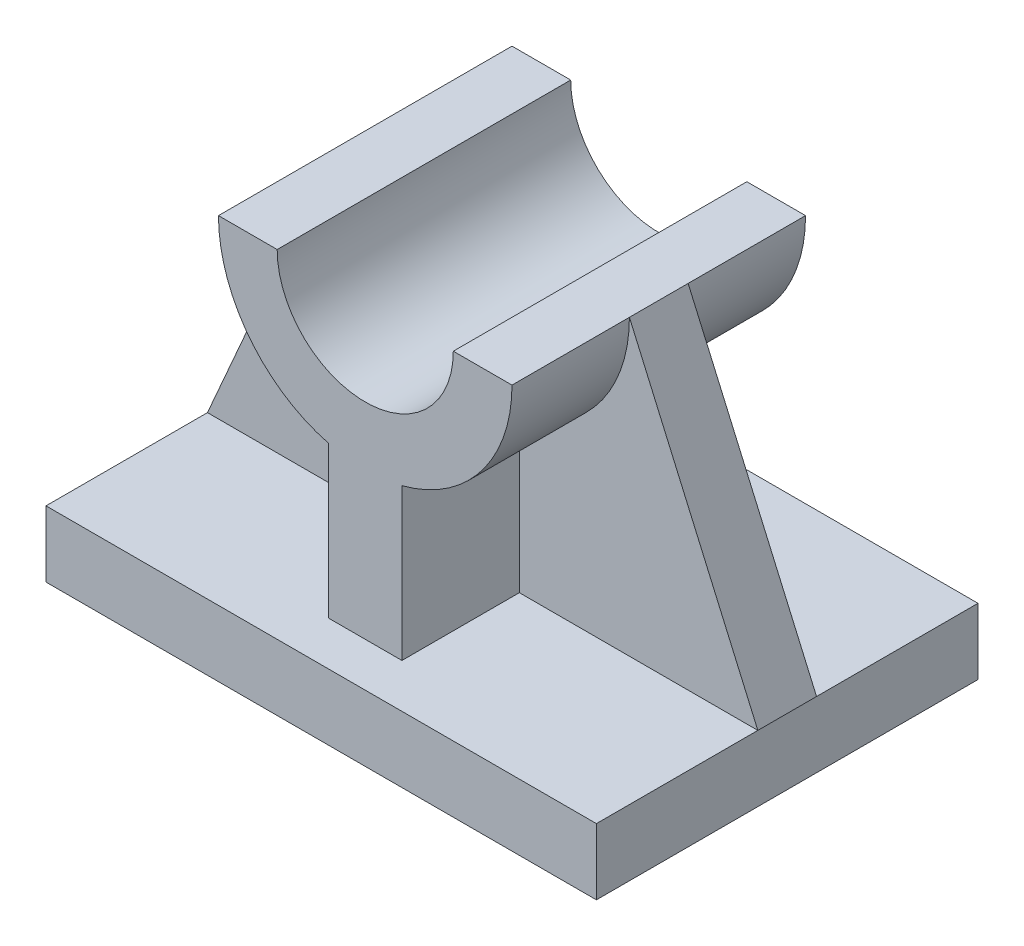
ISO-10303-21;
HEADER;
FILE_DESCRIPTION(('STEP AP214'),'2;1');
FILE_NAME('part.step','',(''),(''),'','','');
FILE_SCHEMA(('AUTOMOTIVE_DESIGN { 1 0 10303 214 1 1 1 1 }'));
ENDSEC;
DATA;
#1=APPLICATION_CONTEXT('core data for automotive mechanical design processes');
#2=APPLICATION_PROTOCOL_DEFINITION('international standard','automotive_design',2000,#1);
#3=PRODUCT_CONTEXT('',#1,'mechanical');
#4=PRODUCT('Part','Part','',(#3));
#5=PRODUCT_RELATED_PRODUCT_CATEGORY('part','',(#4));
#6=PRODUCT_DEFINITION_FORMATION('','',#4);
#7=PRODUCT_DEFINITION_CONTEXT('part definition',#1,'design');
#8=PRODUCT_DEFINITION('design','',#6,#7);
#9=PRODUCT_DEFINITION_SHAPE('','',#8);
#10=(LENGTH_UNIT() NAMED_UNIT(*) SI_UNIT(.MILLI.,.METRE.));
#11=(NAMED_UNIT(*) PLANE_ANGLE_UNIT() SI_UNIT($,.RADIAN.));
#12=(NAMED_UNIT(*) SI_UNIT($,.STERADIAN.) SOLID_ANGLE_UNIT());
#13=UNCERTAINTY_MEASURE_WITH_UNIT(LENGTH_MEASURE(1.E-05),#10,'distance_accuracy_value','');
#14=(GEOMETRIC_REPRESENTATION_CONTEXT(3) GLOBAL_UNCERTAINTY_ASSIGNED_CONTEXT((#13)) GLOBAL_UNIT_ASSIGNED_CONTEXT((#10,
#11,#12)) REPRESENTATION_CONTEXT('',''));
#15=CARTESIAN_POINT('',(0.,0.,0.));
#16=DIRECTION('',(0.,0.,1.));
#17=DIRECTION('',(1.,0.,0.));
#18=AXIS2_PLACEMENT_3D('',#15,#16,#17);
#19=CARTESIAN_POINT('',(0.,-40.,26.));
#20=DIRECTION('',(0.,1.,0.));
#21=DIRECTION('',(-1.,0.,0.));
#22=AXIS2_PLACEMENT_3D('',#19,#20,#21);
#23=PLANE('',#22);
#24=DIRECTION('',(0.,0.,-1.));
#25=VECTOR('',#24,1.);
#26=CARTESIAN_POINT('',(-37.4999999999999,-40.,26.));
#27=LINE('',#26,#25);
#28=CARTESIAN_POINT('',(-37.4999999999999,-40.,-3.99999999999999));
#29=VERTEX_POINT('',#28);
#30=CARTESIAN_POINT('',(-37.4999999999999,-40.,-26.));
#31=VERTEX_POINT('',#30);
#32=EDGE_CURVE('E61',#29,#31,#27,.T.);
#33=ORIENTED_EDGE('',*,*,#32,.F.);
#34=DIRECTION('',(1.,0.,0.));
#35=VECTOR('',#34,1.);
#36=CARTESIAN_POINT('',(0.,-40.,-4.));
#37=LINE('',#36,#35);
#38=CARTESIAN_POINT('',(-5.,-40.,-4.));
#39=VERTEX_POINT('',#38);
#40=EDGE_CURVE('E198',#29,#39,#37,.T.);
#41=ORIENTED_EDGE('',*,*,#40,.T.);
#42=DIRECTION('',(0.,0.,-1.));
#43=VECTOR('',#42,1.);
#44=CARTESIAN_POINT('',(-5.,-40.,20.));
#45=LINE('',#44,#43);
#46=CARTESIAN_POINT('',(-5.,-40.,-20.));
#47=VERTEX_POINT('',#46);
#48=EDGE_CURVE('E184',#39,#47,#45,.T.);
#49=ORIENTED_EDGE('',*,*,#48,.T.);
#50=DIRECTION('',(1.,0.,0.));
#51=VECTOR('',#50,1.);
#52=CARTESIAN_POINT('',(0.,-40.,-20.));
#53=LINE('',#52,#51);
#54=CARTESIAN_POINT('',(5.,-40.,-20.));
#55=VERTEX_POINT('',#54);
#56=EDGE_CURVE('E266',#47,#55,#53,.T.);
#57=ORIENTED_EDGE('',*,*,#56,.T.);
#58=DIRECTION('',(0.,0.,-1.));
#59=VECTOR('',#58,1.);
#60=CARTESIAN_POINT('',(5.,-40.,20.));
#61=LINE('',#60,#59);
#62=CARTESIAN_POINT('',(5.,-40.,-4.));
#63=VERTEX_POINT('',#62);
#64=EDGE_CURVE('E290',#63,#55,#61,.T.);
#65=ORIENTED_EDGE('',*,*,#64,.F.);
#66=DIRECTION('',(1.,0.,0.));
#67=VECTOR('',#66,1.);
#68=CARTESIAN_POINT('',(0.,-40.,-4.));
#69=LINE('',#68,#67);
#70=CARTESIAN_POINT('',(37.5,-40.,-4.));
#71=VERTEX_POINT('',#70);
#72=EDGE_CURVE('E247',#63,#71,#69,.T.);
#73=ORIENTED_EDGE('',*,*,#72,.T.);
#74=DIRECTION('',(0.,0.,-1.));
#75=VECTOR('',#74,1.);
#76=CARTESIAN_POINT('',(37.5,-40.,26.));
#77=LINE('',#76,#75);
#78=CARTESIAN_POINT('',(37.5,-40.,-26.));
#79=VERTEX_POINT('',#78);
#80=EDGE_CURVE('E54',#71,#79,#77,.T.);
#81=ORIENTED_EDGE('',*,*,#80,.T.);
#82=DIRECTION('',(1.,0.,0.));
#83=VECTOR('',#82,1.);
#84=CARTESIAN_POINT('',(0.,-40.,-26.));
#85=LINE('',#84,#83);
#86=EDGE_CURVE('E368',#31,#79,#85,.T.);
#87=ORIENTED_EDGE('',*,*,#86,.F.);
#88=EDGE_LOOP('',(#33,#41,#49,#57,#65,#73,#81,#87));
#89=FACE_BOUND('',#88,.T.);
#90=ADVANCED_FACE('F45',(#89),#23,.T.);
#91=CARTESIAN_POINT('',(0.,0.,20.));
#92=DIRECTION('',(0.,0.,-1.));
#93=DIRECTION('',(-1.,0.,0.));
#94=AXIS2_PLACEMENT_3D('',#91,#92,#93);
#95=CYLINDRICAL_SURFACE('',#94,20.);
#96=CARTESIAN_POINT('',(0.,0.,-4.));
#97=DIRECTION('',(0.,0.,1.));
#98=DIRECTION('',(1.,0.,0.));
#99=AXIS2_PLACEMENT_3D('',#96,#97,#98);
#100=CIRCLE('',#99,20.);
#101=CARTESIAN_POINT('',(-20.,0.,-4.));
#102=VERTEX_POINT('',#101);
#103=CARTESIAN_POINT('',(-5.,-19.3649167310371,-4.));
#104=VERTEX_POINT('',#103);
#105=EDGE_CURVE('E206',#102,#104,#100,.T.);
#106=ORIENTED_EDGE('',*,*,#105,.F.);
#107=DIRECTION('',(0.,0.,-1.));
#108=VECTOR('',#107,1.);
#109=CARTESIAN_POINT('',(-20.,0.,20.));
#110=LINE('',#109,#108);
#111=CARTESIAN_POINT('',(-20.,0.,-20.));
#112=VERTEX_POINT('',#111);
#113=EDGE_CURVE('E327',#102,#112,#110,.T.);
#114=ORIENTED_EDGE('',*,*,#113,.T.);
#115=CARTESIAN_POINT('',(0.,0.,-20.));
#116=DIRECTION('',(0.,0.,1.));
#117=DIRECTION('',(1.,0.,0.));
#118=AXIS2_PLACEMENT_3D('',#115,#116,#117);
#119=CIRCLE('',#118,20.);
#120=CARTESIAN_POINT('',(-5.,-19.3649167310371,-20.));
#121=VERTEX_POINT('',#120);
#122=EDGE_CURVE('E310',#112,#121,#119,.T.);
#123=ORIENTED_EDGE('',*,*,#122,.T.);
#124=DIRECTION('',(0.,0.,-1.));
#125=VECTOR('',#124,1.);
#126=CARTESIAN_POINT('',(-5.,-19.3649167310371,20.));
#127=LINE('',#126,#125);
#128=EDGE_CURVE('E322',#104,#121,#127,.T.);
#129=ORIENTED_EDGE('',*,*,#128,.F.);
#130=EDGE_LOOP('',(#106,#114,#123,#129));
#131=FACE_BOUND('',#130,.T.);
#132=ADVANCED_FACE('F478',(#131),#95,.T.);
#133=CARTESIAN_POINT('',(-5.,0.,20.));
#134=DIRECTION('',(1.,0.,0.));
#135=DIRECTION('',(0.,1.,0.));
#136=AXIS2_PLACEMENT_3D('',#133,#134,#135);
#137=PLANE('',#136);
#138=DIRECTION('',(0.,-1.,0.));
#139=VECTOR('',#138,1.);
#140=CARTESIAN_POINT('',(-5.,0.,-4.));
#141=LINE('',#140,#139);
#142=EDGE_CURVE('E187',#104,#39,#141,.T.);
#143=ORIENTED_EDGE('',*,*,#142,.F.);
#144=ORIENTED_EDGE('',*,*,#128,.T.);
#145=DIRECTION('',(0.,-1.,0.));
#146=VECTOR('',#145,1.);
#147=CARTESIAN_POINT('',(-5.,0.,-20.));
#148=LINE('',#147,#146);
#149=EDGE_CURVE('E190',#121,#47,#148,.T.);
#150=ORIENTED_EDGE('',*,*,#149,.T.);
#151=ORIENTED_EDGE('',*,*,#48,.F.);
#152=EDGE_LOOP('',(#143,#144,#150,#151));
#153=FACE_BOUND('',#152,.T.);
#154=ADVANCED_FACE('F185',(#153),#137,.F.);
#155=CARTESIAN_POINT('',(5.,0.,20.));
#156=DIRECTION('',(1.,0.,0.));
#157=DIRECTION('',(0.,1.,0.));
#158=AXIS2_PLACEMENT_3D('',#155,#156,#157);
#159=PLANE('',#158);
#160=DIRECTION('',(0.,0.,-1.));
#161=VECTOR('',#160,1.);
#162=CARTESIAN_POINT('',(5.,-19.3649167310371,20.));
#163=LINE('',#162,#161);
#164=CARTESIAN_POINT('',(5.,-19.3649167310371,-4.));
#165=VERTEX_POINT('',#164);
#166=CARTESIAN_POINT('',(5.,-19.3649167310371,-20.));
#167=VERTEX_POINT('',#166);
#168=EDGE_CURVE('E343',#165,#167,#163,.T.);
#169=ORIENTED_EDGE('',*,*,#168,.F.);
#170=DIRECTION('',(0.,-1.,0.));
#171=VECTOR('',#170,1.);
#172=CARTESIAN_POINT('',(5.,0.,-4.));
#173=LINE('',#172,#171);
#174=EDGE_CURVE('E243',#165,#63,#173,.T.);
#175=ORIENTED_EDGE('',*,*,#174,.T.);
#176=ORIENTED_EDGE('',*,*,#64,.T.);
#177=DIRECTION('',(0.,-1.,0.));
#178=VECTOR('',#177,1.);
#179=CARTESIAN_POINT('',(5.,0.,-20.));
#180=LINE('',#179,#178);
#181=EDGE_CURVE('E260',#167,#55,#180,.T.);
#182=ORIENTED_EDGE('',*,*,#181,.F.);
#183=EDGE_LOOP('',(#169,#175,#176,#182));
#184=FACE_BOUND('',#183,.T.);
#185=ADVANCED_FACE('F484',(#184),#159,.T.);
#186=CARTESIAN_POINT('',(0.,0.,20.));
#187=DIRECTION('',(0.,0.,-1.));
#188=DIRECTION('',(-1.,0.,0.));
#189=AXIS2_PLACEMENT_3D('',#186,#187,#188);
#190=CYLINDRICAL_SURFACE('',#189,20.);
#191=CARTESIAN_POINT('',(0.,0.,-4.));
#192=DIRECTION('',(0.,0.,1.));
#193=DIRECTION('',(1.,0.,0.));
#194=AXIS2_PLACEMENT_3D('',#191,#192,#193);
#195=CIRCLE('',#194,20.);
#196=CARTESIAN_POINT('',(20.,0.,-4.));
#197=VERTEX_POINT('',#196);
#198=EDGE_CURVE('E223',#165,#197,#195,.T.);
#199=ORIENTED_EDGE('',*,*,#198,.F.);
#200=ORIENTED_EDGE('',*,*,#168,.T.);
#201=CARTESIAN_POINT('',(0.,0.,-20.));
#202=DIRECTION('',(0.,0.,1.));
#203=DIRECTION('',(1.,0.,0.));
#204=AXIS2_PLACEMENT_3D('',#201,#202,#203);
#205=CIRCLE('',#204,20.);
#206=CARTESIAN_POINT('',(20.,0.,-20.));
#207=VERTEX_POINT('',#206);
#208=EDGE_CURVE('E294',#167,#207,#205,.T.);
#209=ORIENTED_EDGE('',*,*,#208,.T.);
#210=DIRECTION('',(0.,0.,-1.));
#211=VECTOR('',#210,1.);
#212=CARTESIAN_POINT('',(20.,0.,20.));
#213=LINE('',#212,#211);
#214=EDGE_CURVE('E338',#197,#207,#213,.T.);
#215=ORIENTED_EDGE('',*,*,#214,.F.);
#216=EDGE_LOOP('',(#199,#200,#209,#215));
#217=FACE_BOUND('',#216,.T.);
#218=ADVANCED_FACE('F423',(#217),#190,.T.);
#219=CARTESIAN_POINT('',(37.5,0.,26.));
#220=DIRECTION('',(1.,0.,0.));
#221=DIRECTION('',(0.,1.,0.));
#222=AXIS2_PLACEMENT_3D('',#219,#220,#221);
#223=PLANE('',#222);
#224=DIRECTION('',(0.,-1.,0.));
#225=VECTOR('',#224,1.);
#226=CARTESIAN_POINT('',(37.5,0.,-26.));
#227=LINE('',#226,#225);
#228=CARTESIAN_POINT('',(37.5000000000001,-49.,-26.));
#229=VERTEX_POINT('',#228);
#230=EDGE_CURVE('E348',#79,#229,#227,.T.);
#231=ORIENTED_EDGE('',*,*,#230,.F.);
#232=ORIENTED_EDGE('',*,*,#80,.F.);
#233=DIRECTION('',(0.,0.,-1.));
#234=VECTOR('',#233,1.);
#235=CARTESIAN_POINT('',(37.5,-40.,4.));
#236=LINE('',#235,#234);
#237=CARTESIAN_POINT('',(37.5,-40.,4.));
#238=VERTEX_POINT('',#237);
#239=EDGE_CURVE('E257',#238,#71,#236,.T.);
#240=ORIENTED_EDGE('',*,*,#239,.F.);
#241=CARTESIAN_POINT('',(37.5,-40.,26.));
#242=VERTEX_POINT('',#241);
#243=EDGE_CURVE('E11',#242,#238,#77,.T.);
#244=ORIENTED_EDGE('',*,*,#243,.F.);
#245=DIRECTION('',(0.,-1.,0.));
#246=VECTOR('',#245,1.);
#247=CARTESIAN_POINT('',(37.5,0.,26.));
#248=LINE('',#247,#246);
#249=CARTESIAN_POINT('',(37.5000000000001,-49.,26.));
#250=VERTEX_POINT('',#249);
#251=EDGE_CURVE('E349',#242,#250,#248,.T.);
#252=ORIENTED_EDGE('',*,*,#251,.T.);
#253=DIRECTION('',(0.,0.,-1.));
#254=VECTOR('',#253,1.);
#255=CARTESIAN_POINT('',(37.5000000000001,-49.,26.));
#256=LINE('',#255,#254);
#257=EDGE_CURVE('E364',#250,#229,#256,.T.);
#258=ORIENTED_EDGE('',*,*,#257,.T.);
#259=EDGE_LOOP('',(#231,#232,#240,#244,#252,#258));
#260=FACE_BOUND('',#259,.T.);
#261=ADVANCED_FACE('F47',(#260),#223,.T.);
#262=DIRECTION('',(1.,0.,0.));
#263=VECTOR('',#262,1.);
#264=CARTESIAN_POINT('',(0.,-40.,4.));
#265=LINE('',#264,#263);
#266=CARTESIAN_POINT('',(-37.4999999999999,-40.,4.00000000000001));
#267=VERTEX_POINT('',#266);
#268=CARTESIAN_POINT('',(-5.,-40.,4.));
#269=VERTEX_POINT('',#268);
#270=EDGE_CURVE('E69',#267,#269,#265,.T.);
#271=ORIENTED_EDGE('',*,*,#270,.F.);
#272=CARTESIAN_POINT('',(-37.4999999999999,-40.,26.));
#273=VERTEX_POINT('',#272);
#274=EDGE_CURVE('E383',#273,#267,#27,.T.);
#275=ORIENTED_EDGE('',*,*,#274,.F.);
#276=DIRECTION('',(1.,0.,0.));
#277=VECTOR('',#276,1.);
#278=CARTESIAN_POINT('',(0.,-40.,26.));
#279=LINE('',#278,#277);
#280=EDGE_CURVE('E353',#273,#242,#279,.T.);
#281=ORIENTED_EDGE('',*,*,#280,.T.);
#282=ORIENTED_EDGE('',*,*,#243,.T.);
#283=DIRECTION('',(1.,0.,0.));
#284=VECTOR('',#283,1.);
#285=CARTESIAN_POINT('',(0.,-40.,4.));
#286=LINE('',#285,#284);
#287=CARTESIAN_POINT('',(5.,-40.,4.));
#288=VERTEX_POINT('',#287);
#289=EDGE_CURVE('E232',#288,#238,#286,.T.);
#290=ORIENTED_EDGE('',*,*,#289,.F.);
#291=CARTESIAN_POINT('',(5.,-40.,20.));
#292=VERTEX_POINT('',#291);
#293=EDGE_CURVE('E195',#292,#288,#61,.T.);
#294=ORIENTED_EDGE('',*,*,#293,.F.);
#295=DIRECTION('',(1.,0.,0.));
#296=VECTOR('',#295,1.);
#297=CARTESIAN_POINT('',(0.,-40.,20.));
#298=LINE('',#297,#296);
#299=CARTESIAN_POINT('',(-5.,-40.,20.));
#300=VERTEX_POINT('',#299);
#301=EDGE_CURVE('E287',#300,#292,#298,.T.);
#302=ORIENTED_EDGE('',*,*,#301,.F.);
#303=EDGE_CURVE('E194',#300,#269,#45,.T.);
#304=ORIENTED_EDGE('',*,*,#303,.T.);
#305=EDGE_LOOP('',(#271,#275,#281,#282,#290,#294,#302,#304));
#306=FACE_BOUND('',#305,.T.);
#307=ADVANCED_FACE('F411',(#306),#23,.T.);
#308=CARTESIAN_POINT('',(-37.4999999999999,0.,26.));
#309=DIRECTION('',(1.,0.,0.));
#310=DIRECTION('',(0.,0.,-1.));
#311=AXIS2_PLACEMENT_3D('',#308,#309,#310);
#312=PLANE('',#311);
#313=DIRECTION('',(0.,-1.,0.));
#314=VECTOR('',#313,1.);
#315=CARTESIAN_POINT('',(-37.4999999999999,0.,-26.));
#316=LINE('',#315,#314);
#317=CARTESIAN_POINT('',(-37.4999999999999,-49.,-26.));
#318=VERTEX_POINT('',#317);
#319=EDGE_CURVE('E372',#31,#318,#316,.T.);
#320=ORIENTED_EDGE('',*,*,#319,.T.);
#321=DIRECTION('',(0.,0.,-1.));
#322=VECTOR('',#321,1.);
#323=CARTESIAN_POINT('',(-37.4999999999999,-49.,26.));
#324=LINE('',#323,#322);
#325=CARTESIAN_POINT('',(-37.4999999999999,-49.,26.));
#326=VERTEX_POINT('',#325);
#327=EDGE_CURVE('E380',#326,#318,#324,.T.);
#328=ORIENTED_EDGE('',*,*,#327,.F.);
#329=DIRECTION('',(0.,-1.,0.));
#330=VECTOR('',#329,1.);
#331=CARTESIAN_POINT('',(-37.4999999999999,0.,26.));
#332=LINE('',#331,#330);
#333=EDGE_CURVE('E358',#273,#326,#332,.T.);
#334=ORIENTED_EDGE('',*,*,#333,.F.);
#335=ORIENTED_EDGE('',*,*,#274,.T.);
#336=DIRECTION('',(0.,0.,-1.));
#337=VECTOR('',#336,1.);
#338=CARTESIAN_POINT('',(-37.4999999999999,-40.,4.));
#339=LINE('',#338,#337);
#340=EDGE_CURVE('E215',#267,#29,#339,.T.);
#341=ORIENTED_EDGE('',*,*,#340,.T.);
#342=ORIENTED_EDGE('',*,*,#32,.T.);
#343=EDGE_LOOP('',(#320,#328,#334,#335,#341,#342));
#344=FACE_BOUND('',#343,.T.);
#345=ADVANCED_FACE('F391',(#344),#312,.F.);
#346=CARTESIAN_POINT('',(0.,-49.,26.));
#347=DIRECTION('',(0.,1.,0.));
#348=DIRECTION('',(0.,0.,1.));
#349=AXIS2_PLACEMENT_3D('',#346,#347,#348);
#350=PLANE('',#349);
#351=DIRECTION('',(1.,0.,0.));
#352=VECTOR('',#351,1.);
#353=CARTESIAN_POINT('',(0.,-49.,-26.));
#354=LINE('',#353,#352);
#355=EDGE_CURVE('E354',#318,#229,#354,.T.);
#356=ORIENTED_EDGE('',*,*,#355,.T.);
#357=ORIENTED_EDGE('',*,*,#257,.F.);
#358=DIRECTION('',(1.,0.,0.));
#359=VECTOR('',#358,1.);
#360=CARTESIAN_POINT('',(0.,-49.,26.));
#361=LINE('',#360,#359);
#362=EDGE_CURVE('E361',#326,#250,#361,.T.);
#363=ORIENTED_EDGE('',*,*,#362,.F.);
#364=ORIENTED_EDGE('',*,*,#327,.T.);
#365=EDGE_LOOP('',(#356,#357,#363,#364));
#366=FACE_BOUND('',#365,.T.);
#367=ADVANCED_FACE('F407',(#366),#350,.F.);
#368=CARTESIAN_POINT('',(0.,0.,26.));
#369=DIRECTION('',(0.,0.,1.));
#370=DIRECTION('',(1.,0.,0.));
#371=AXIS2_PLACEMENT_3D('',#368,#369,#370);
#372=PLANE('',#371);
#373=ORIENTED_EDGE('',*,*,#251,.F.);
#374=ORIENTED_EDGE('',*,*,#280,.F.);
#375=ORIENTED_EDGE('',*,*,#333,.T.);
#376=ORIENTED_EDGE('',*,*,#362,.T.);
#377=EDGE_LOOP('',(#373,#374,#375,#376));
#378=FACE_BOUND('',#377,.T.);
#379=ADVANCED_FACE('F410',(#378),#372,.T.);
#380=CARTESIAN_POINT('',(0.,0.,-26.));
#381=DIRECTION('',(0.,0.,1.));
#382=DIRECTION('',(1.,0.,0.));
#383=AXIS2_PLACEMENT_3D('',#380,#381,#382);
#384=PLANE('',#383);
#385=ORIENTED_EDGE('',*,*,#230,.T.);
#386=ORIENTED_EDGE('',*,*,#355,.F.);
#387=ORIENTED_EDGE('',*,*,#319,.F.);
#388=ORIENTED_EDGE('',*,*,#86,.T.);
#389=EDGE_LOOP('',(#385,#386,#387,#388));
#390=FACE_BOUND('',#389,.T.);
#391=ADVANCED_FACE('F397',(#390),#384,.F.);
#392=DIRECTION('',(0.,-1.,0.));
#393=VECTOR('',#392,1.);
#394=CARTESIAN_POINT('',(5.,0.,4.));
#395=LINE('',#394,#393);
#396=CARTESIAN_POINT('',(5.,-19.3649167310371,4.));
#397=VERTEX_POINT('',#396);
#398=EDGE_CURVE('E228',#397,#288,#395,.T.);
#399=ORIENTED_EDGE('',*,*,#398,.F.);
#400=CARTESIAN_POINT('',(5.,-19.3649167310371,20.));
#401=VERTEX_POINT('',#400);
#402=EDGE_CURVE('E344',#401,#397,#163,.T.);
#403=ORIENTED_EDGE('',*,*,#402,.F.);
#404=DIRECTION('',(0.,-1.,0.));
#405=VECTOR('',#404,1.);
#406=CARTESIAN_POINT('',(5.,0.,20.));
#407=LINE('',#406,#405);
#408=EDGE_CURVE('E261',#401,#292,#407,.T.);
#409=ORIENTED_EDGE('',*,*,#408,.T.);
#410=ORIENTED_EDGE('',*,*,#293,.T.);
#411=EDGE_LOOP('',(#399,#403,#409,#410));
#412=FACE_BOUND('',#411,.T.);
#413=ADVANCED_FACE('F438',(#412),#159,.T.);
#414=ORIENTED_EDGE('',*,*,#402,.T.);
#415=CARTESIAN_POINT('',(0.,0.,4.));
#416=DIRECTION('',(0.,0.,1.));
#417=DIRECTION('',(1.,0.,0.));
#418=AXIS2_PLACEMENT_3D('',#415,#416,#417);
#419=CIRCLE('',#418,20.);
#420=CARTESIAN_POINT('',(20.,0.,4.));
#421=VERTEX_POINT('',#420);
#422=EDGE_CURVE('E224',#397,#421,#419,.T.);
#423=ORIENTED_EDGE('',*,*,#422,.T.);
#424=CARTESIAN_POINT('',(20.,0.,20.));
#425=VERTEX_POINT('',#424);
#426=EDGE_CURVE('E339',#425,#421,#213,.T.);
#427=ORIENTED_EDGE('',*,*,#426,.F.);
#428=CARTESIAN_POINT('',(0.,0.,20.));
#429=DIRECTION('',(0.,0.,1.));
#430=DIRECTION('',(1.,0.,0.));
#431=AXIS2_PLACEMENT_3D('',#428,#429,#430);
#432=CIRCLE('',#431,20.);
#433=EDGE_CURVE('E265',#401,#425,#432,.T.);
#434=ORIENTED_EDGE('',*,*,#433,.F.);
#435=EDGE_LOOP('',(#414,#423,#427,#434));
#436=FACE_BOUND('',#435,.T.);
#437=ADVANCED_FACE('F434',(#436),#190,.T.);
#438=CARTESIAN_POINT('',(0.,0.,20.));
#439=DIRECTION('',(0.,1.,0.));
#440=DIRECTION('',(0.,0.,1.));
#441=AXIS2_PLACEMENT_3D('',#438,#439,#440);
#442=PLANE('',#441);
#443=DIRECTION('',(1.,0.,0.));
#444=VECTOR('',#443,1.);
#445=CARTESIAN_POINT('',(0.,0.,-20.));
#446=LINE('',#445,#444);
#447=CARTESIAN_POINT('',(12.,0.,-20.));
#448=VERTEX_POINT('',#447);
#449=EDGE_CURVE('E298',#448,#207,#446,.T.);
#450=ORIENTED_EDGE('',*,*,#449,.F.);
#451=DIRECTION('',(0.,0.,-1.));
#452=VECTOR('',#451,1.);
#453=CARTESIAN_POINT('',(12.,0.,20.));
#454=LINE('',#453,#452);
#455=CARTESIAN_POINT('',(12.,0.,20.));
#456=VERTEX_POINT('',#455);
#457=EDGE_CURVE('E335',#456,#448,#454,.T.);
#458=ORIENTED_EDGE('',*,*,#457,.F.);
#459=DIRECTION('',(1.,0.,0.));
#460=VECTOR('',#459,1.);
#461=CARTESIAN_POINT('',(0.,0.,20.));
#462=LINE('',#461,#460);
#463=EDGE_CURVE('E269',#456,#425,#462,.T.);
#464=ORIENTED_EDGE('',*,*,#463,.T.);
#465=ORIENTED_EDGE('',*,*,#426,.T.);
#466=DIRECTION('',(0.,0.,-1.));
#467=VECTOR('',#466,1.);
#468=CARTESIAN_POINT('',(20.,0.,4.));
#469=LINE('',#468,#467);
#470=EDGE_CURVE('E239',#421,#197,#469,.T.);
#471=ORIENTED_EDGE('',*,*,#470,.T.);
#472=ORIENTED_EDGE('',*,*,#214,.T.);
#473=EDGE_LOOP('',(#450,#458,#464,#465,#471,#472));
#474=FACE_BOUND('',#473,.T.);
#475=ADVANCED_FACE('F428',(#474),#442,.T.);
#476=CARTESIAN_POINT('',(0.,0.,20.));
#477=DIRECTION('',(0.,0.,-1.));
#478=DIRECTION('',(-1.,0.,0.));
#479=AXIS2_PLACEMENT_3D('',#476,#477,#478);
#480=CYLINDRICAL_SURFACE('',#479,12.);
#481=CARTESIAN_POINT('',(0.,0.,-20.));
#482=DIRECTION('',(0.,0.,1.));
#483=DIRECTION('',(1.,0.,0.));
#484=AXIS2_PLACEMENT_3D('',#481,#482,#483);
#485=CIRCLE('',#484,12.);
#486=CARTESIAN_POINT('',(-12.,0.,-20.));
#487=VERTEX_POINT('',#486);
#488=EDGE_CURVE('E302',#487,#448,#485,.T.);
#489=ORIENTED_EDGE('',*,*,#488,.F.);
#490=DIRECTION('',(0.,0.,-1.));
#491=VECTOR('',#490,1.);
#492=CARTESIAN_POINT('',(-12.,0.,20.));
#493=LINE('',#492,#491);
#494=CARTESIAN_POINT('',(-12.,0.,20.));
#495=VERTEX_POINT('',#494);
#496=EDGE_CURVE('E332',#495,#487,#493,.T.);
#497=ORIENTED_EDGE('',*,*,#496,.F.);
#498=CARTESIAN_POINT('',(0.,0.,20.));
#499=DIRECTION('',(0.,0.,1.));
#500=DIRECTION('',(1.,0.,0.));
#501=AXIS2_PLACEMENT_3D('',#498,#499,#500);
#502=CIRCLE('',#501,12.);
#503=EDGE_CURVE('E273',#495,#456,#502,.T.);
#504=ORIENTED_EDGE('',*,*,#503,.T.);
#505=ORIENTED_EDGE('',*,*,#457,.T.);
#506=EDGE_LOOP('',(#489,#497,#504,#505));
#507=FACE_BOUND('',#506,.T.);
#508=ADVANCED_FACE('F473',(#507),#480,.F.);
#509=CARTESIAN_POINT('',(0.,0.,20.));
#510=DIRECTION('',(0.,1.,0.));
#511=DIRECTION('',(0.,0.,1.));
#512=AXIS2_PLACEMENT_3D('',#509,#510,#511);
#513=PLANE('',#512);
#514=DIRECTION('',(1.,0.,0.));
#515=VECTOR('',#514,1.);
#516=CARTESIAN_POINT('',(0.,0.,-20.));
#517=LINE('',#516,#515);
#518=EDGE_CURVE('E306',#112,#487,#517,.T.);
#519=ORIENTED_EDGE('',*,*,#518,.F.);
#520=ORIENTED_EDGE('',*,*,#113,.F.);
#521=DIRECTION('',(0.,0.,-1.));
#522=VECTOR('',#521,1.);
#523=CARTESIAN_POINT('',(-20.,0.,4.));
#524=LINE('',#523,#522);
#525=CARTESIAN_POINT('',(-20.,0.,4.));
#526=VERTEX_POINT('',#525);
#527=EDGE_CURVE('E218',#526,#102,#524,.T.);
#528=ORIENTED_EDGE('',*,*,#527,.F.);
#529=CARTESIAN_POINT('',(-20.,0.,20.));
#530=VERTEX_POINT('',#529);
#531=EDGE_CURVE('E328',#530,#526,#110,.T.);
#532=ORIENTED_EDGE('',*,*,#531,.F.);
#533=DIRECTION('',(1.,0.,0.));
#534=VECTOR('',#533,1.);
#535=CARTESIAN_POINT('',(0.,0.,20.));
#536=LINE('',#535,#534);
#537=EDGE_CURVE('E277',#530,#495,#536,.T.);
#538=ORIENTED_EDGE('',*,*,#537,.T.);
#539=ORIENTED_EDGE('',*,*,#496,.T.);
#540=EDGE_LOOP('',(#519,#520,#528,#532,#538,#539));
#541=FACE_BOUND('',#540,.T.);
#542=ADVANCED_FACE('F466',(#541),#513,.T.);
#543=ORIENTED_EDGE('',*,*,#531,.T.);
#544=CARTESIAN_POINT('',(0.,0.,4.));
#545=DIRECTION('',(0.,0.,1.));
#546=DIRECTION('',(1.,0.,0.));
#547=AXIS2_PLACEMENT_3D('',#544,#545,#546);
#548=CIRCLE('',#547,20.);
#549=CARTESIAN_POINT('',(-5.,-19.3649167310371,4.));
#550=VERTEX_POINT('',#549);
#551=EDGE_CURVE('E208',#526,#550,#548,.T.);
#552=ORIENTED_EDGE('',*,*,#551,.T.);
#553=CARTESIAN_POINT('',(-5.,-19.3649167310371,20.));
#554=VERTEX_POINT('',#553);
#555=EDGE_CURVE('E323',#554,#550,#127,.T.);
#556=ORIENTED_EDGE('',*,*,#555,.F.);
#557=CARTESIAN_POINT('',(0.,0.,20.));
#558=DIRECTION('',(0.,0.,1.));
#559=DIRECTION('',(1.,0.,0.));
#560=AXIS2_PLACEMENT_3D('',#557,#558,#559);
#561=CIRCLE('',#560,20.);
#562=EDGE_CURVE('E281',#530,#554,#561,.T.);
#563=ORIENTED_EDGE('',*,*,#562,.F.);
#564=EDGE_LOOP('',(#543,#552,#556,#563));
#565=FACE_BOUND('',#564,.T.);
#566=ADVANCED_FACE('F468',(#565),#95,.T.);
#567=ORIENTED_EDGE('',*,*,#555,.T.);
#568=DIRECTION('',(0.,-1.,0.));
#569=VECTOR('',#568,1.);
#570=CARTESIAN_POINT('',(-5.,0.,4.));
#571=LINE('',#570,#569);
#572=EDGE_CURVE('E219',#550,#269,#571,.T.);
#573=ORIENTED_EDGE('',*,*,#572,.T.);
#574=ORIENTED_EDGE('',*,*,#303,.F.);
#575=DIRECTION('',(0.,-1.,0.));
#576=VECTOR('',#575,1.);
#577=CARTESIAN_POINT('',(-5.,0.,20.));
#578=LINE('',#577,#576);
#579=EDGE_CURVE('E284',#554,#300,#578,.T.);
#580=ORIENTED_EDGE('',*,*,#579,.F.);
#581=EDGE_LOOP('',(#567,#573,#574,#580));
#582=FACE_BOUND('',#581,.T.);
#583=ADVANCED_FACE('F448',(#582),#137,.F.);
#584=CARTESIAN_POINT('',(0.,0.,20.));
#585=DIRECTION('',(0.,0.,1.));
#586=DIRECTION('',(1.,0.,0.));
#587=AXIS2_PLACEMENT_3D('',#584,#585,#586);
#588=PLANE('',#587);
#589=ORIENTED_EDGE('',*,*,#408,.F.);
#590=ORIENTED_EDGE('',*,*,#433,.T.);
#591=ORIENTED_EDGE('',*,*,#463,.F.);
#592=ORIENTED_EDGE('',*,*,#503,.F.);
#593=ORIENTED_EDGE('',*,*,#537,.F.);
#594=ORIENTED_EDGE('',*,*,#562,.T.);
#595=ORIENTED_EDGE('',*,*,#579,.T.);
#596=ORIENTED_EDGE('',*,*,#301,.T.);
#597=EDGE_LOOP('',(#589,#590,#591,#592,#593,#594,#595,#596));
#598=FACE_BOUND('',#597,.T.);
#599=ADVANCED_FACE('F442',(#598),#588,.T.);
#600=CARTESIAN_POINT('',(0.,0.,-20.));
#601=DIRECTION('',(0.,0.,1.));
#602=DIRECTION('',(1.,0.,0.));
#603=AXIS2_PLACEMENT_3D('',#600,#601,#602);
#604=PLANE('',#603);
#605=ORIENTED_EDGE('',*,*,#181,.T.);
#606=ORIENTED_EDGE('',*,*,#56,.F.);
#607=ORIENTED_EDGE('',*,*,#149,.F.);
#608=ORIENTED_EDGE('',*,*,#122,.F.);
#609=ORIENTED_EDGE('',*,*,#518,.T.);
#610=ORIENTED_EDGE('',*,*,#488,.T.);
#611=ORIENTED_EDGE('',*,*,#449,.T.);
#612=ORIENTED_EDGE('',*,*,#208,.F.);
#613=EDGE_LOOP('',(#605,#606,#607,#608,#609,#610,#611,#612));
#614=FACE_BOUND('',#613,.T.);
#615=ADVANCED_FACE('F476',(#614),#604,.F.);
#616=CARTESIAN_POINT('',(16.7868852459016,7.34426229508198,4.));
#617=DIRECTION('',(0.916157334902189,0.400818834019709,0.));
#618=DIRECTION('',(-0.400818834019709,0.916157334902189,0.));
#619=AXIS2_PLACEMENT_3D('',#616,#617,#618);
#620=PLANE('',#619);
#621=DIRECTION('',(0.400818834019709,-0.916157334902189,0.));
#622=VECTOR('',#621,1.);
#623=CARTESIAN_POINT('',(16.7868852459016,7.34426229508198,-4.));
#624=LINE('',#623,#622);
#625=EDGE_CURVE('E229',#197,#71,#624,.T.);
#626=ORIENTED_EDGE('',*,*,#625,.F.);
#627=ORIENTED_EDGE('',*,*,#470,.F.);
#628=DIRECTION('',(0.400818834019709,-0.916157334902189,0.));
#629=VECTOR('',#628,1.);
#630=CARTESIAN_POINT('',(16.7868852459016,7.34426229508198,4.));
#631=LINE('',#630,#629);
#632=EDGE_CURVE('E235',#421,#238,#631,.T.);
#633=ORIENTED_EDGE('',*,*,#632,.T.);
#634=ORIENTED_EDGE('',*,*,#239,.T.);
#635=EDGE_LOOP('',(#626,#627,#633,#634));
#636=FACE_BOUND('',#635,.T.);
#637=ADVANCED_FACE('F415',(#636),#620,.T.);
#638=CARTESIAN_POINT('',(0.,0.,4.));
#639=DIRECTION('',(0.,0.,1.));
#640=DIRECTION('',(1.,0.,0.));
#641=AXIS2_PLACEMENT_3D('',#638,#639,#640);
#642=PLANE('',#641);
#643=ORIENTED_EDGE('',*,*,#422,.F.);
#644=ORIENTED_EDGE('',*,*,#398,.T.);
#645=ORIENTED_EDGE('',*,*,#289,.T.);
#646=ORIENTED_EDGE('',*,*,#632,.F.);
#647=EDGE_LOOP('',(#643,#644,#645,#646));
#648=FACE_BOUND('',#647,.T.);
#649=ADVANCED_FACE('F431',(#648),#642,.T.);
#650=CARTESIAN_POINT('',(0.,0.,-4.));
#651=DIRECTION('',(0.,0.,1.));
#652=DIRECTION('',(1.,0.,0.));
#653=AXIS2_PLACEMENT_3D('',#650,#651,#652);
#654=PLANE('',#653);
#655=ORIENTED_EDGE('',*,*,#198,.T.);
#656=ORIENTED_EDGE('',*,*,#625,.T.);
#657=ORIENTED_EDGE('',*,*,#72,.F.);
#658=ORIENTED_EDGE('',*,*,#174,.F.);
#659=EDGE_LOOP('',(#655,#656,#657,#658));
#660=FACE_BOUND('',#659,.T.);
#661=ADVANCED_FACE('F418',(#660),#654,.F.);
#662=CARTESIAN_POINT('',(-16.7868852459017,7.34426229508195,4.));
#663=DIRECTION('',(0.91615733490219,-0.400818834019707,0.));
#664=DIRECTION('',(0.400818834019707,0.91615733490219,0.));
#665=AXIS2_PLACEMENT_3D('',#662,#663,#664);
#666=PLANE('',#665);
#667=DIRECTION('',(-0.400818834019707,-0.91615733490219,0.));
#668=VECTOR('',#667,1.);
#669=CARTESIAN_POINT('',(-16.7868852459017,7.34426229508195,-4.));
#670=LINE('',#669,#668);
#671=EDGE_CURVE('E202',#102,#29,#670,.T.);
#672=ORIENTED_EDGE('',*,*,#671,.T.);
#673=ORIENTED_EDGE('',*,*,#340,.F.);
#674=DIRECTION('',(-0.400818834019707,-0.91615733490219,0.));
#675=VECTOR('',#674,1.);
#676=CARTESIAN_POINT('',(-16.7868852459017,7.34426229508195,4.));
#677=LINE('',#676,#675);
#678=EDGE_CURVE('E211',#526,#267,#677,.T.);
#679=ORIENTED_EDGE('',*,*,#678,.F.);
#680=ORIENTED_EDGE('',*,*,#527,.T.);
#681=EDGE_LOOP('',(#672,#673,#679,#680));
#682=FACE_BOUND('',#681,.T.);
#683=ADVANCED_FACE('F461',(#682),#666,.F.);
#684=CARTESIAN_POINT('',(0.,0.,4.));
#685=DIRECTION('',(0.,0.,1.));
#686=DIRECTION('',(1.,0.,0.));
#687=AXIS2_PLACEMENT_3D('',#684,#685,#686);
#688=PLANE('',#687);
#689=ORIENTED_EDGE('',*,*,#551,.F.);
#690=ORIENTED_EDGE('',*,*,#678,.T.);
#691=ORIENTED_EDGE('',*,*,#270,.T.);
#692=ORIENTED_EDGE('',*,*,#572,.F.);
#693=EDGE_LOOP('',(#689,#690,#691,#692));
#694=FACE_BOUND('',#693,.T.);
#695=ADVANCED_FACE('F680',(#694),#688,.T.);
#696=CARTESIAN_POINT('',(0.,0.,-4.));
#697=DIRECTION('',(0.,0.,1.));
#698=DIRECTION('',(1.,0.,0.));
#699=AXIS2_PLACEMENT_3D('',#696,#697,#698);
#700=PLANE('',#699);
#701=ORIENTED_EDGE('',*,*,#105,.T.);
#702=ORIENTED_EDGE('',*,*,#142,.T.);
#703=ORIENTED_EDGE('',*,*,#40,.F.);
#704=ORIENTED_EDGE('',*,*,#671,.F.);
#705=EDGE_LOOP('',(#701,#702,#703,#704));
#706=FACE_BOUND('',#705,.T.);
#707=ADVANCED_FACE('F205',(#706),#700,.F.);
#708=CLOSED_SHELL('',(#90,#132,#154,#185,#218,#261,#307,#345,#367,#379,#391,#413,#437,#475,#508,
#542,#566,#583,#599,#615,#637,#649,#661,#683,#695,#707));
#709=MANIFOLD_SOLID_BREP('B2',#708);
#710=ADVANCED_BREP_SHAPE_REPRESENTATION('',(#18,#709),#14);
#711=SHAPE_DEFINITION_REPRESENTATION(#9,#710);
ENDSEC;
END-ISO-10303-21;
